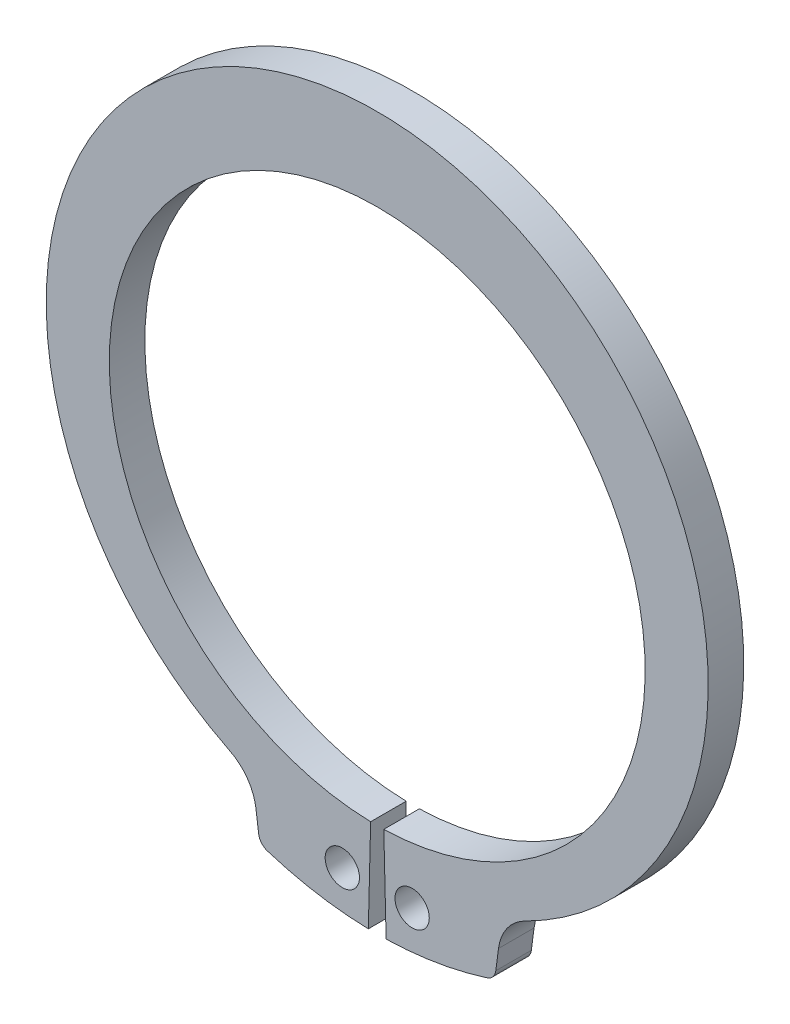
ISO-10303-21;
HEADER;
FILE_DESCRIPTION(('STEP AP214'),'2;1');
FILE_NAME('part.step','',(''),(''),'','','');
FILE_SCHEMA(('AUTOMOTIVE_DESIGN { 1 0 10303 214 1 1 1 1 }'));
ENDSEC;
DATA;
#1=APPLICATION_CONTEXT('core data for automotive mechanical design processes');
#2=APPLICATION_PROTOCOL_DEFINITION('international standard','automotive_design',2000,#1);
#3=PRODUCT_CONTEXT('',#1,'mechanical');
#4=PRODUCT('Part','Part','',(#3));
#5=PRODUCT_RELATED_PRODUCT_CATEGORY('part','',(#4));
#6=PRODUCT_DEFINITION_FORMATION('','',#4);
#7=PRODUCT_DEFINITION_CONTEXT('part definition',#1,'design');
#8=PRODUCT_DEFINITION('design','',#6,#7);
#9=PRODUCT_DEFINITION_SHAPE('','',#8);
#10=(LENGTH_UNIT() NAMED_UNIT(*) SI_UNIT(.MILLI.,.METRE.));
#11=(NAMED_UNIT(*) PLANE_ANGLE_UNIT() SI_UNIT($,.RADIAN.));
#12=(NAMED_UNIT(*) SI_UNIT($,.STERADIAN.) SOLID_ANGLE_UNIT());
#13=UNCERTAINTY_MEASURE_WITH_UNIT(LENGTH_MEASURE(1.E-05),#10,'distance_accuracy_value','');
#14=(GEOMETRIC_REPRESENTATION_CONTEXT(3) GLOBAL_UNCERTAINTY_ASSIGNED_CONTEXT((#13)) GLOBAL_UNIT_ASSIGNED_CONTEXT((#10,
#11,#12)) REPRESENTATION_CONTEXT('',''));
#15=CARTESIAN_POINT('',(0.,0.,0.));
#16=DIRECTION('',(0.,0.,1.));
#17=DIRECTION('',(1.,0.,0.));
#18=AXIS2_PLACEMENT_3D('',#15,#16,#17);
#19=CARTESIAN_POINT('',(0.,0.,-2.8));
#20=DIRECTION('',(0.,0.,1.));
#21=DIRECTION('',(1.,0.,0.));
#22=AXIS2_PLACEMENT_3D('',#19,#20,#21);
#23=CYLINDRICAL_SURFACE('',#22,21.1);
#24=CARTESIAN_POINT('',(0.,0.,0.));
#25=DIRECTION('',(0.,0.,-1.));
#26=DIRECTION('',(1.,0.,0.));
#27=AXIS2_PLACEMENT_3D('',#24,#25,#26);
#28=CIRCLE('',#27,21.1);
#29=CARTESIAN_POINT('',(-0.518245614035088,-21.0936346200349,0.));
#30=VERTEX_POINT('',#29);
#31=CARTESIAN_POINT('',(0.518245614035088,-21.0936346200349,0.));
#32=VERTEX_POINT('',#31);
#33=EDGE_CURVE('E156',#30,#32,#28,.T.);
#34=ORIENTED_EDGE('',*,*,#33,.F.);
#35=DIRECTION('',(0.,0.,1.));
#36=VECTOR('',#35,1.);
#37=CARTESIAN_POINT('',(-0.518245614035088,-21.0936346200349,-2.8));
#38=LINE('',#37,#36);
#39=CARTESIAN_POINT('',(-0.518245614035088,-21.0936346200349,-2.8));
#40=VERTEX_POINT('',#39);
#41=EDGE_CURVE('E11',#40,#30,#38,.T.);
#42=ORIENTED_EDGE('',*,*,#41,.F.);
#43=CARTESIAN_POINT('',(0.,0.,-2.8));
#44=DIRECTION('',(0.,0.,-1.));
#45=DIRECTION('',(1.,0.,0.));
#46=AXIS2_PLACEMENT_3D('',#43,#44,#45);
#47=CIRCLE('',#46,21.1);
#48=CARTESIAN_POINT('',(0.518245614035088,-21.0936346200349,-2.8));
#49=VERTEX_POINT('',#48);
#50=EDGE_CURVE('E189',#40,#49,#47,.T.);
#51=ORIENTED_EDGE('',*,*,#50,.T.);
#52=DIRECTION('',(0.,0.,1.));
#53=VECTOR('',#52,1.);
#54=CARTESIAN_POINT('',(0.518245614035088,-21.0936346200349,-2.8));
#55=LINE('',#54,#53);
#56=EDGE_CURVE('E38',#49,#32,#55,.T.);
#57=ORIENTED_EDGE('',*,*,#56,.T.);
#58=EDGE_LOOP('',(#34,#42,#51,#57));
#59=FACE_BOUND('',#58,.T.);
#60=ADVANCED_FACE('F35',(#59),#23,.F.);
#61=CARTESIAN_POINT('',(-0.518245614035088,-21.0936346200349,-2.8));
#62=DIRECTION('',(0.999698323224401,-0.0245614035087719,0.));
#63=DIRECTION('',(0.0245614035087719,0.999698323224401,0.));
#64=AXIS2_PLACEMENT_3D('',#61,#62,#63);
#65=PLANE('',#64);
#66=DIRECTION('',(0.0245614035087719,0.999698323224401,0.));
#67=VECTOR('',#66,1.);
#68=CARTESIAN_POINT('',(-0.518245614035088,-21.0936346200349,0.));
#69=LINE('',#68,#67);
#70=CARTESIAN_POINT('',(-0.7,-28.4914022118954,0.));
#71=VERTEX_POINT('',#70);
#72=EDGE_CURVE('E187',#71,#30,#69,.T.);
#73=ORIENTED_EDGE('',*,*,#72,.F.);
#74=DIRECTION('',(0.,0.,1.));
#75=VECTOR('',#74,1.);
#76=CARTESIAN_POINT('',(-0.7,-28.4914022118954,-2.8));
#77=LINE('',#76,#75);
#78=CARTESIAN_POINT('',(-0.7,-28.4914022118954,-2.8));
#79=VERTEX_POINT('',#78);
#80=EDGE_CURVE('E44',#79,#71,#77,.T.);
#81=ORIENTED_EDGE('',*,*,#80,.F.);
#82=DIRECTION('',(0.0245614035087719,0.999698323224401,0.));
#83=VECTOR('',#82,1.);
#84=CARTESIAN_POINT('',(-0.518245614035088,-21.0936346200349,-2.8));
#85=LINE('',#84,#83);
#86=EDGE_CURVE('E146',#79,#40,#85,.T.);
#87=ORIENTED_EDGE('',*,*,#86,.T.);
#88=ORIENTED_EDGE('',*,*,#41,.T.);
#89=EDGE_LOOP('',(#73,#81,#87,#88));
#90=FACE_BOUND('',#89,.T.);
#91=ADVANCED_FACE('F209',(#90),#65,.T.);
#92=CARTESIAN_POINT('',(0.,0.,-2.8));
#93=DIRECTION('',(0.,0.,1.));
#94=DIRECTION('',(1.,0.,0.));
#95=AXIS2_PLACEMENT_3D('',#92,#93,#94);
#96=CYLINDRICAL_SURFACE('',#95,28.5);
#97=CARTESIAN_POINT('',(0.,0.,0.));
#98=DIRECTION('',(0.,0.,1.));
#99=DIRECTION('',(1.,0.,0.));
#100=AXIS2_PLACEMENT_3D('',#97,#98,#99);
#101=CIRCLE('',#100,28.5);
#102=CARTESIAN_POINT('',(-8.64901741522964,-27.1559293295415,0.));
#103=VERTEX_POINT('',#102);
#104=EDGE_CURVE('E133',#103,#71,#101,.T.);
#105=ORIENTED_EDGE('',*,*,#104,.F.);
#106=DIRECTION('',(0.,0.,1.));
#107=VECTOR('',#106,1.);
#108=CARTESIAN_POINT('',(-8.64901741522964,-27.1559293295415,-2.8));
#109=LINE('',#108,#107);
#110=CARTESIAN_POINT('',(-8.64901741522964,-27.1559293295415,-2.8));
#111=VERTEX_POINT('',#110);
#112=EDGE_CURVE('E128',#111,#103,#109,.T.);
#113=ORIENTED_EDGE('',*,*,#112,.F.);
#114=CARTESIAN_POINT('',(0.,0.,-2.8));
#115=DIRECTION('',(0.,0.,1.));
#116=DIRECTION('',(1.,0.,0.));
#117=AXIS2_PLACEMENT_3D('',#114,#115,#116);
#118=CIRCLE('',#117,28.5);
#119=EDGE_CURVE('E131',#111,#79,#118,.T.);
#120=ORIENTED_EDGE('',*,*,#119,.T.);
#121=ORIENTED_EDGE('',*,*,#80,.T.);
#122=EDGE_LOOP('',(#105,#113,#120,#121));
#123=FACE_BOUND('',#122,.T.);
#124=ADVANCED_FACE('F130',(#123),#96,.T.);
#125=CARTESIAN_POINT('',(-8.34554311995842,-26.2030897039436,-2.8));
#126=DIRECTION('',(0.,0.,1.));
#127=DIRECTION('',(1.,0.,0.));
#128=AXIS2_PLACEMENT_3D('',#125,#126,#127);
#129=CYLINDRICAL_SURFACE('',#128,1.);
#130=CARTESIAN_POINT('',(-8.34554311995842,-26.2030897039436,0.));
#131=DIRECTION('',(0.,0.,1.));
#132=DIRECTION('',(1.,0.,0.));
#133=AXIS2_PLACEMENT_3D('',#130,#131,#132);
#134=CIRCLE('',#133,1.);
#135=CARTESIAN_POINT('',(-9.33698798133223,-26.3336158961636,0.));
#136=VERTEX_POINT('',#135);
#137=EDGE_CURVE('E184',#136,#103,#134,.T.);
#138=ORIENTED_EDGE('',*,*,#137,.F.);
#139=DIRECTION('',(0.,0.,1.));
#140=VECTOR('',#139,1.);
#141=CARTESIAN_POINT('',(-9.33698798133223,-26.3336158961636,-2.8));
#142=LINE('',#141,#140);
#143=CARTESIAN_POINT('',(-9.33698798133223,-26.3336158961636,-2.8));
#144=VERTEX_POINT('',#143);
#145=EDGE_CURVE('E138',#144,#136,#142,.T.);
#146=ORIENTED_EDGE('',*,*,#145,.F.);
#147=CARTESIAN_POINT('',(-8.34554311995842,-26.2030897039436,-2.8));
#148=DIRECTION('',(0.,0.,1.));
#149=DIRECTION('',(1.,0.,0.));
#150=AXIS2_PLACEMENT_3D('',#147,#148,#149);
#151=CIRCLE('',#150,1.);
#152=EDGE_CURVE('E144',#144,#111,#151,.T.);
#153=ORIENTED_EDGE('',*,*,#152,.T.);
#154=ORIENTED_EDGE('',*,*,#112,.T.);
#155=EDGE_LOOP('',(#138,#146,#153,#154));
#156=FACE_BOUND('',#155,.T.);
#157=ADVANCED_FACE('F148',(#156),#129,.T.);
#158=CARTESIAN_POINT('',(-9.5519379049942,-24.7009091294783,-2.8));
#159=DIRECTION('',(-0.99144486137381,-0.130526192220052,0.));
#160=DIRECTION('',(0.130526192220052,-0.99144486137381,0.));
#161=AXIS2_PLACEMENT_3D('',#158,#159,#160);
#162=PLANE('',#161);
#163=DIRECTION('',(0.130526192220052,-0.99144486137381,0.));
#164=VECTOR('',#163,1.);
#165=CARTESIAN_POINT('',(-9.5519379049942,-24.7009091294783,0.));
#166=LINE('',#165,#164);
#167=CARTESIAN_POINT('',(-9.5519379049942,-24.7009091294783,0.));
#168=VERTEX_POINT('',#167);
#169=EDGE_CURVE('E181',#168,#136,#166,.T.);
#170=ORIENTED_EDGE('',*,*,#169,.F.);
#171=DIRECTION('',(0.,0.,1.));
#172=VECTOR('',#171,1.);
#173=CARTESIAN_POINT('',(-9.5519379049942,-24.7009091294783,-2.8));
#174=LINE('',#173,#172);
#175=CARTESIAN_POINT('',(-9.5519379049942,-24.7009091294783,-2.8));
#176=VERTEX_POINT('',#175);
#177=EDGE_CURVE('E193',#176,#168,#174,.T.);
#178=ORIENTED_EDGE('',*,*,#177,.F.);
#179=DIRECTION('',(0.130526192220052,-0.99144486137381,0.));
#180=VECTOR('',#179,1.);
#181=CARTESIAN_POINT('',(-9.5519379049942,-24.7009091294783,-2.8));
#182=LINE('',#181,#180);
#183=EDGE_CURVE('E149',#176,#144,#182,.T.);
#184=ORIENTED_EDGE('',*,*,#183,.T.);
#185=ORIENTED_EDGE('',*,*,#145,.T.);
#186=EDGE_LOOP('',(#170,#178,#184,#185));
#187=FACE_BOUND('',#186,.T.);
#188=ADVANCED_FACE('F222',(#187),#162,.T.);
#189=CARTESIAN_POINT('',(-13.3181847421388,-25.196744932119,-2.8));
#190=DIRECTION('',(0.,0.,1.));
#191=DIRECTION('',(1.,0.,0.));
#192=AXIS2_PLACEMENT_3D('',#189,#190,#191);
#193=CYLINDRICAL_SURFACE('',#192,3.79874563263739);
#194=CARTESIAN_POINT('',(-13.3181847421388,-25.196744932119,0.));
#195=DIRECTION('',(0.,0.,-1.));
#196=DIRECTION('',(1.,0.,0.));
#197=AXIS2_PLACEMENT_3D('',#194,#195,#196);
#198=CIRCLE('',#197,3.79874563263739);
#199=CARTESIAN_POINT('',(-11.6241358188381,-21.7966469001579,0.));
#200=VERTEX_POINT('',#199);
#201=EDGE_CURVE('E178',#200,#168,#198,.T.);
#202=ORIENTED_EDGE('',*,*,#201,.F.);
#203=DIRECTION('',(0.,0.,1.));
#204=VECTOR('',#203,1.);
#205=CARTESIAN_POINT('',(-11.6241358188381,-21.7966469001579,-2.8));
#206=LINE('',#205,#204);
#207=CARTESIAN_POINT('',(-11.6241358188381,-21.7966469001579,-2.8));
#208=VERTEX_POINT('',#207);
#209=EDGE_CURVE('E195',#208,#200,#206,.T.);
#210=ORIENTED_EDGE('',*,*,#209,.F.);
#211=CARTESIAN_POINT('',(-13.3181847421388,-25.196744932119,-2.8));
#212=DIRECTION('',(0.,0.,-1.));
#213=DIRECTION('',(1.,0.,0.));
#214=AXIS2_PLACEMENT_3D('',#211,#212,#213);
#215=CIRCLE('',#214,3.79874563263739);
#216=EDGE_CURVE('E151',#208,#176,#215,.T.);
#217=ORIENTED_EDGE('',*,*,#216,.T.);
#218=ORIENTED_EDGE('',*,*,#177,.T.);
#219=EDGE_LOOP('',(#202,#210,#217,#218));
#220=FACE_BOUND('',#219,.T.);
#221=ADVANCED_FACE('F225',(#220),#193,.F.);
#222=CARTESIAN_POINT('',(0.,1.53396697837964,-2.8));
#223=DIRECTION('',(0.,0.,1.));
#224=DIRECTION('',(1.,0.,0.));
#225=AXIS2_PLACEMENT_3D('',#222,#223,#224);
#226=CYLINDRICAL_SURFACE('',#225,26.0660330216204);
#227=CARTESIAN_POINT('',(0.,1.53396697837964,0.));
#228=DIRECTION('',(0.,0.,1.));
#229=DIRECTION('',(1.,0.,0.));
#230=AXIS2_PLACEMENT_3D('',#227,#228,#229);
#231=CIRCLE('',#230,26.0660330216204);
#232=CARTESIAN_POINT('',(11.6241358188381,-21.7966469001579,0.));
#233=VERTEX_POINT('',#232);
#234=EDGE_CURVE('E175',#233,#200,#231,.T.);
#235=ORIENTED_EDGE('',*,*,#234,.F.);
#236=DIRECTION('',(0.,0.,1.));
#237=VECTOR('',#236,1.);
#238=CARTESIAN_POINT('',(11.6241358188381,-21.7966469001579,-2.8));
#239=LINE('',#238,#237);
#240=CARTESIAN_POINT('',(11.6241358188381,-21.7966469001579,-2.8));
#241=VERTEX_POINT('',#240);
#242=EDGE_CURVE('E197',#241,#233,#239,.T.);
#243=ORIENTED_EDGE('',*,*,#242,.F.);
#244=CARTESIAN_POINT('',(0.,1.53396697837964,-2.8));
#245=DIRECTION('',(0.,0.,1.));
#246=DIRECTION('',(1.,0.,0.));
#247=AXIS2_PLACEMENT_3D('',#244,#245,#246);
#248=CIRCLE('',#247,26.0660330216204);
#249=EDGE_CURVE('E299',#241,#208,#248,.T.);
#250=ORIENTED_EDGE('',*,*,#249,.T.);
#251=ORIENTED_EDGE('',*,*,#209,.T.);
#252=EDGE_LOOP('',(#235,#243,#250,#251));
#253=FACE_BOUND('',#252,.T.);
#254=ADVANCED_FACE('F229',(#253),#226,.T.);
#255=CARTESIAN_POINT('',(13.3181847421388,-25.196744932119,-2.8));
#256=DIRECTION('',(0.,0.,1.));
#257=DIRECTION('',(1.,0.,0.));
#258=AXIS2_PLACEMENT_3D('',#255,#256,#257);
#259=CYLINDRICAL_SURFACE('',#258,3.79874563263739);
#260=CARTESIAN_POINT('',(13.3181847421388,-25.196744932119,0.));
#261=DIRECTION('',(0.,0.,-1.));
#262=DIRECTION('',(1.,0.,0.));
#263=AXIS2_PLACEMENT_3D('',#260,#261,#262);
#264=CIRCLE('',#263,3.79874563263739);
#265=CARTESIAN_POINT('',(9.5519379049942,-24.7009091294783,0.));
#266=VERTEX_POINT('',#265);
#267=EDGE_CURVE('E172',#266,#233,#264,.T.);
#268=ORIENTED_EDGE('',*,*,#267,.F.);
#269=DIRECTION('',(0.,0.,1.));
#270=VECTOR('',#269,1.);
#271=CARTESIAN_POINT('',(9.5519379049942,-24.7009091294783,-2.8));
#272=LINE('',#271,#270);
#273=CARTESIAN_POINT('',(9.5519379049942,-24.7009091294783,-2.8));
#274=VERTEX_POINT('',#273);
#275=EDGE_CURVE('E199',#274,#266,#272,.T.);
#276=ORIENTED_EDGE('',*,*,#275,.F.);
#277=CARTESIAN_POINT('',(13.3181847421388,-25.196744932119,-2.8));
#278=DIRECTION('',(0.,0.,-1.));
#279=DIRECTION('',(1.,0.,0.));
#280=AXIS2_PLACEMENT_3D('',#277,#278,#279);
#281=CIRCLE('',#280,3.79874563263739);
#282=EDGE_CURVE('E296',#274,#241,#281,.T.);
#283=ORIENTED_EDGE('',*,*,#282,.T.);
#284=ORIENTED_EDGE('',*,*,#242,.T.);
#285=EDGE_LOOP('',(#268,#276,#283,#284));
#286=FACE_BOUND('',#285,.T.);
#287=ADVANCED_FACE('F233',(#286),#259,.F.);
#288=CARTESIAN_POINT('',(9.5519379049942,-24.7009091294783,-2.8));
#289=DIRECTION('',(0.99144486137381,-0.130526192220052,0.));
#290=DIRECTION('',(0.130526192220052,0.99144486137381,0.));
#291=AXIS2_PLACEMENT_3D('',#288,#289,#290);
#292=PLANE('',#291);
#293=DIRECTION('',(0.130526192220052,0.99144486137381,0.));
#294=VECTOR('',#293,1.);
#295=CARTESIAN_POINT('',(9.5519379049942,-24.7009091294783,0.));
#296=LINE('',#295,#294);
#297=CARTESIAN_POINT('',(9.33698798133223,-26.3336158961636,0.));
#298=VERTEX_POINT('',#297);
#299=EDGE_CURVE('E169',#298,#266,#296,.T.);
#300=ORIENTED_EDGE('',*,*,#299,.F.);
#301=DIRECTION('',(0.,0.,1.));
#302=VECTOR('',#301,1.);
#303=CARTESIAN_POINT('',(9.33698798133223,-26.3336158961636,-2.8));
#304=LINE('',#303,#302);
#305=CARTESIAN_POINT('',(9.33698798133223,-26.3336158961636,-2.8));
#306=VERTEX_POINT('',#305);
#307=EDGE_CURVE('E201',#306,#298,#304,.T.);
#308=ORIENTED_EDGE('',*,*,#307,.F.);
#309=DIRECTION('',(0.130526192220052,0.99144486137381,0.));
#310=VECTOR('',#309,1.);
#311=CARTESIAN_POINT('',(9.5519379049942,-24.7009091294783,-2.8));
#312=LINE('',#311,#310);
#313=EDGE_CURVE('E293',#306,#274,#312,.T.);
#314=ORIENTED_EDGE('',*,*,#313,.T.);
#315=ORIENTED_EDGE('',*,*,#275,.T.);
#316=EDGE_LOOP('',(#300,#308,#314,#315));
#317=FACE_BOUND('',#316,.T.);
#318=ADVANCED_FACE('F237',(#317),#292,.T.);
#319=CARTESIAN_POINT('',(8.34554311995842,-26.2030897039436,-2.8));
#320=DIRECTION('',(0.,0.,1.));
#321=DIRECTION('',(1.,0.,0.));
#322=AXIS2_PLACEMENT_3D('',#319,#320,#321);
#323=CYLINDRICAL_SURFACE('',#322,1.);
#324=CARTESIAN_POINT('',(8.34554311995842,-26.2030897039436,0.));
#325=DIRECTION('',(0.,0.,1.));
#326=DIRECTION('',(-1.,0.,0.));
#327=AXIS2_PLACEMENT_3D('',#324,#325,#326);
#328=CIRCLE('',#327,1.);
#329=CARTESIAN_POINT('',(8.64901741522963,-27.1559293295415,0.));
#330=VERTEX_POINT('',#329);
#331=EDGE_CURVE('E166',#330,#298,#328,.T.);
#332=ORIENTED_EDGE('',*,*,#331,.F.);
#333=DIRECTION('',(0.,0.,1.));
#334=VECTOR('',#333,1.);
#335=CARTESIAN_POINT('',(8.64901741522963,-27.1559293295415,-2.8));
#336=LINE('',#335,#334);
#337=CARTESIAN_POINT('',(8.64901741522963,-27.1559293295415,-2.8));
#338=VERTEX_POINT('',#337);
#339=EDGE_CURVE('E203',#338,#330,#336,.T.);
#340=ORIENTED_EDGE('',*,*,#339,.F.);
#341=CARTESIAN_POINT('',(8.34554311995842,-26.2030897039436,-2.8));
#342=DIRECTION('',(0.,0.,1.));
#343=DIRECTION('',(-1.,0.,0.));
#344=AXIS2_PLACEMENT_3D('',#341,#342,#343);
#345=CIRCLE('',#344,1.);
#346=EDGE_CURVE('E290',#338,#306,#345,.T.);
#347=ORIENTED_EDGE('',*,*,#346,.T.);
#348=ORIENTED_EDGE('',*,*,#307,.T.);
#349=EDGE_LOOP('',(#332,#340,#347,#348));
#350=FACE_BOUND('',#349,.T.);
#351=ADVANCED_FACE('F241',(#350),#323,.T.);
#352=CARTESIAN_POINT('',(0.,0.,-2.8));
#353=DIRECTION('',(0.,0.,1.));
#354=DIRECTION('',(1.,0.,0.));
#355=AXIS2_PLACEMENT_3D('',#352,#353,#354);
#356=CYLINDRICAL_SURFACE('',#355,28.5);
#357=CARTESIAN_POINT('',(0.,0.,0.));
#358=DIRECTION('',(0.,0.,1.));
#359=DIRECTION('',(1.,0.,0.));
#360=AXIS2_PLACEMENT_3D('',#357,#358,#359);
#361=CIRCLE('',#360,28.5);
#362=CARTESIAN_POINT('',(0.7,-28.4914022118954,0.));
#363=VERTEX_POINT('',#362);
#364=EDGE_CURVE('E163',#363,#330,#361,.T.);
#365=ORIENTED_EDGE('',*,*,#364,.F.);
#366=DIRECTION('',(0.,0.,1.));
#367=VECTOR('',#366,1.);
#368=CARTESIAN_POINT('',(0.7,-28.4914022118954,-2.8));
#369=LINE('',#368,#367);
#370=CARTESIAN_POINT('',(0.7,-28.4914022118954,-2.8));
#371=VERTEX_POINT('',#370);
#372=EDGE_CURVE('E204',#371,#363,#369,.T.);
#373=ORIENTED_EDGE('',*,*,#372,.F.);
#374=CARTESIAN_POINT('',(0.,0.,-2.8));
#375=DIRECTION('',(0.,0.,1.));
#376=DIRECTION('',(1.,0.,0.));
#377=AXIS2_PLACEMENT_3D('',#374,#375,#376);
#378=CIRCLE('',#377,28.5);
#379=EDGE_CURVE('E287',#371,#338,#378,.T.);
#380=ORIENTED_EDGE('',*,*,#379,.T.);
#381=ORIENTED_EDGE('',*,*,#339,.T.);
#382=EDGE_LOOP('',(#365,#373,#380,#381));
#383=FACE_BOUND('',#382,.T.);
#384=ADVANCED_FACE('F245',(#383),#356,.T.);
#385=CARTESIAN_POINT('',(0.518245614035088,-21.0936346200349,-2.8));
#386=DIRECTION('',(-0.999698323224401,-0.0245614035087719,0.));
#387=DIRECTION('',(0.0245614035087719,-0.999698323224401,0.));
#388=AXIS2_PLACEMENT_3D('',#385,#386,#387);
#389=PLANE('',#388);
#390=DIRECTION('',(0.0245614035087719,-0.999698323224401,0.));
#391=VECTOR('',#390,1.);
#392=CARTESIAN_POINT('',(0.518245614035088,-21.0936346200349,0.));
#393=LINE('',#392,#391);
#394=EDGE_CURVE('E159',#32,#363,#393,.T.);
#395=ORIENTED_EDGE('',*,*,#394,.F.);
#396=ORIENTED_EDGE('',*,*,#56,.F.);
#397=DIRECTION('',(0.0245614035087719,-0.999698323224401,0.));
#398=VECTOR('',#397,1.);
#399=CARTESIAN_POINT('',(0.518245614035088,-21.0936346200349,-2.8));
#400=LINE('',#399,#398);
#401=EDGE_CURVE('E285',#49,#371,#400,.T.);
#402=ORIENTED_EDGE('',*,*,#401,.T.);
#403=ORIENTED_EDGE('',*,*,#372,.T.);
#404=EDGE_LOOP('',(#395,#396,#402,#403));
#405=FACE_BOUND('',#404,.T.);
#406=ADVANCED_FACE('F206',(#405),#389,.T.);
#407=CARTESIAN_POINT('',(0.,0.,-2.8));
#408=DIRECTION('',(0.,0.,1.));
#409=DIRECTION('',(1.,0.,0.));
#410=AXIS2_PLACEMENT_3D('',#407,#408,#409);
#411=PLANE('',#410);
#412=CARTESIAN_POINT('',(-2.75,-25.3512820188644,-2.8));
#413=DIRECTION('',(0.,0.,1.));
#414=DIRECTION('',(1.,0.,0.));
#415=AXIS2_PLACEMENT_3D('',#412,#413,#414);
#416=CIRCLE('',#415,1.35);
#417=CARTESIAN_POINT('',(-1.4,-25.3512820188644,-2.8));
#418=VERTEX_POINT('',#417);
#419=EDGE_CURVE('E272',#418,#418,#416,.T.);
#420=ORIENTED_EDGE('',*,*,#419,.T.);
#421=EDGE_LOOP('',(#420));
#422=FACE_BOUND('',#421,.T.);
#423=CARTESIAN_POINT('',(2.75,-25.3512820188644,-2.8));
#424=DIRECTION('',(0.,0.,1.));
#425=DIRECTION('',(1.,0.,0.));
#426=AXIS2_PLACEMENT_3D('',#423,#424,#425);
#427=CIRCLE('',#426,1.35);
#428=CARTESIAN_POINT('',(4.1,-25.3512820188644,-2.8));
#429=VERTEX_POINT('',#428);
#430=EDGE_CURVE('E160',#429,#429,#427,.T.);
#431=ORIENTED_EDGE('',*,*,#430,.T.);
#432=EDGE_LOOP('',(#431));
#433=FACE_BOUND('',#432,.T.);
#434=ORIENTED_EDGE('',*,*,#50,.F.);
#435=ORIENTED_EDGE('',*,*,#86,.F.);
#436=ORIENTED_EDGE('',*,*,#119,.F.);
#437=ORIENTED_EDGE('',*,*,#152,.F.);
#438=ORIENTED_EDGE('',*,*,#183,.F.);
#439=ORIENTED_EDGE('',*,*,#216,.F.);
#440=ORIENTED_EDGE('',*,*,#249,.F.);
#441=ORIENTED_EDGE('',*,*,#282,.F.);
#442=ORIENTED_EDGE('',*,*,#313,.F.);
#443=ORIENTED_EDGE('',*,*,#346,.F.);
#444=ORIENTED_EDGE('',*,*,#379,.F.);
#445=ORIENTED_EDGE('',*,*,#401,.F.);
#446=EDGE_LOOP('',(#434,#435,#436,#437,#438,#439,#440,#441,#442,#443,#444,#445));
#447=FACE_BOUND('',#446,.T.);
#448=ADVANCED_FACE('F142',(#422,#433,#447),#411,.F.);
#449=CARTESIAN_POINT('',(0.,0.,0.));
#450=DIRECTION('',(0.,0.,1.));
#451=DIRECTION('',(1.,0.,0.));
#452=AXIS2_PLACEMENT_3D('',#449,#450,#451);
#453=PLANE('',#452);
#454=CARTESIAN_POINT('',(-2.75,-25.3512820188644,0.));
#455=DIRECTION('',(0.,0.,1.));
#456=DIRECTION('',(1.,0.,0.));
#457=AXIS2_PLACEMENT_3D('',#454,#455,#456);
#458=CIRCLE('',#457,1.35);
#459=CARTESIAN_POINT('',(-1.4,-25.3512820188644,0.));
#460=VERTEX_POINT('',#459);
#461=EDGE_CURVE('E275',#460,#460,#458,.T.);
#462=ORIENTED_EDGE('',*,*,#461,.F.);
#463=EDGE_LOOP('',(#462));
#464=FACE_BOUND('',#463,.T.);
#465=CARTESIAN_POINT('',(2.75,-25.3512820188644,0.));
#466=DIRECTION('',(0.,0.,1.));
#467=DIRECTION('',(1.,0.,0.));
#468=AXIS2_PLACEMENT_3D('',#465,#466,#467);
#469=CIRCLE('',#468,1.35);
#470=CARTESIAN_POINT('',(4.1,-25.3512820188644,0.));
#471=VERTEX_POINT('',#470);
#472=EDGE_CURVE('E277',#471,#471,#469,.T.);
#473=ORIENTED_EDGE('',*,*,#472,.F.);
#474=EDGE_LOOP('',(#473));
#475=FACE_BOUND('',#474,.T.);
#476=ORIENTED_EDGE('',*,*,#33,.T.);
#477=ORIENTED_EDGE('',*,*,#394,.T.);
#478=ORIENTED_EDGE('',*,*,#364,.T.);
#479=ORIENTED_EDGE('',*,*,#331,.T.);
#480=ORIENTED_EDGE('',*,*,#299,.T.);
#481=ORIENTED_EDGE('',*,*,#267,.T.);
#482=ORIENTED_EDGE('',*,*,#234,.T.);
#483=ORIENTED_EDGE('',*,*,#201,.T.);
#484=ORIENTED_EDGE('',*,*,#169,.T.);
#485=ORIENTED_EDGE('',*,*,#137,.T.);
#486=ORIENTED_EDGE('',*,*,#104,.T.);
#487=ORIENTED_EDGE('',*,*,#72,.T.);
#488=EDGE_LOOP('',(#476,#477,#478,#479,#480,#481,#482,#483,#484,#485,#486,#487));
#489=FACE_BOUND('',#488,.T.);
#490=ADVANCED_FACE('F208',(#464,#475,#489),#453,.T.);
#491=CARTESIAN_POINT('',(2.75,-25.3512820188644,-2.8));
#492=DIRECTION('',(0.,0.,1.));
#493=DIRECTION('',(1.,0.,0.));
#494=AXIS2_PLACEMENT_3D('',#491,#492,#493);
#495=CYLINDRICAL_SURFACE('',#494,1.35);
#496=ORIENTED_EDGE('',*,*,#430,.F.);
#497=EDGE_LOOP('',(#496));
#498=FACE_BOUND('',#497,.T.);
#499=ORIENTED_EDGE('',*,*,#472,.T.);
#500=EDGE_LOOP('',(#499));
#501=FACE_BOUND('',#500,.T.);
#502=ADVANCED_FACE('F257',(#498,#501),#495,.F.);
#503=CARTESIAN_POINT('',(-2.75,-25.3512820188644,-2.8));
#504=DIRECTION('',(0.,0.,1.));
#505=DIRECTION('',(1.,0.,0.));
#506=AXIS2_PLACEMENT_3D('',#503,#504,#505);
#507=CYLINDRICAL_SURFACE('',#506,1.35);
#508=ORIENTED_EDGE('',*,*,#419,.F.);
#509=EDGE_LOOP('',(#508));
#510=FACE_BOUND('',#509,.T.);
#511=ORIENTED_EDGE('',*,*,#461,.T.);
#512=EDGE_LOOP('',(#511));
#513=FACE_BOUND('',#512,.T.);
#514=ADVANCED_FACE('F264',(#510,#513),#507,.F.);
#515=CLOSED_SHELL('',(#60,#91,#124,#157,#188,#221,#254,#287,#318,#351,#384,#406,#448,#490,#502,#514));
#516=MANIFOLD_SOLID_BREP('B2',#515);
#517=ADVANCED_BREP_SHAPE_REPRESENTATION('',(#18,#516),#14);
#518=SHAPE_DEFINITION_REPRESENTATION(#9,#517);
ENDSEC;
END-ISO-10303-21;
